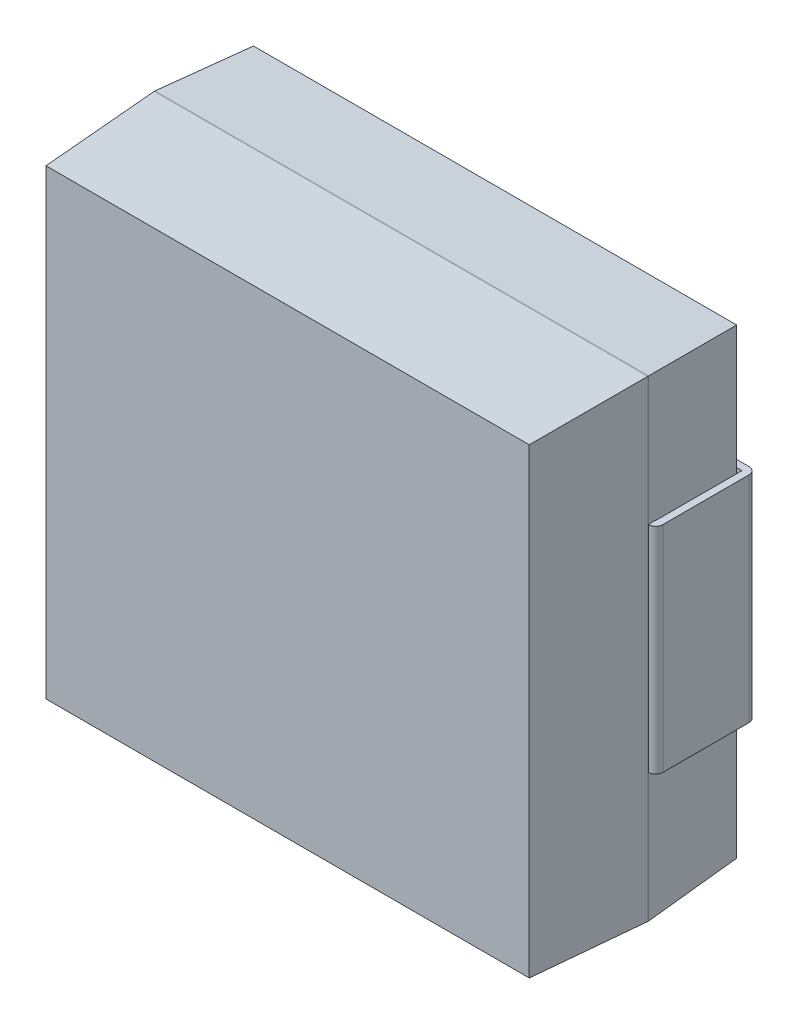
ISO-10303-21;
HEADER;
FILE_DESCRIPTION(('STEP AP214'),'2;1');
FILE_NAME('part.step','',(''),(''),'','','');
FILE_SCHEMA(('AUTOMOTIVE_DESIGN { 1 0 10303 214 1 1 1 1 }'));
ENDSEC;
DATA;
#1=APPLICATION_CONTEXT('core data for automotive mechanical design processes');
#2=APPLICATION_PROTOCOL_DEFINITION('international standard','automotive_design',2000,#1);
#3=PRODUCT_CONTEXT('',#1,'mechanical');
#4=PRODUCT('Part','Part','',(#3));
#5=PRODUCT_RELATED_PRODUCT_CATEGORY('part','',(#4));
#6=PRODUCT_DEFINITION_FORMATION('','',#4);
#7=PRODUCT_DEFINITION_CONTEXT('part definition',#1,'design');
#8=PRODUCT_DEFINITION('design','',#6,#7);
#9=PRODUCT_DEFINITION_SHAPE('','',#8);
#10=(LENGTH_UNIT() NAMED_UNIT(*) SI_UNIT(.MILLI.,.METRE.));
#11=(NAMED_UNIT(*) PLANE_ANGLE_UNIT() SI_UNIT($,.RADIAN.));
#12=(NAMED_UNIT(*) SI_UNIT($,.STERADIAN.) SOLID_ANGLE_UNIT());
#13=UNCERTAINTY_MEASURE_WITH_UNIT(LENGTH_MEASURE(1.E-05),#10,'distance_accuracy_value','');
#14=(GEOMETRIC_REPRESENTATION_CONTEXT(3) GLOBAL_UNCERTAINTY_ASSIGNED_CONTEXT((#13)) GLOBAL_UNIT_ASSIGNED_CONTEXT((#10,
#11,#12)) REPRESENTATION_CONTEXT('',''));
#15=CARTESIAN_POINT('',(0.,0.,0.));
#16=DIRECTION('',(0.,0.,1.));
#17=DIRECTION('',(1.,0.,0.));
#18=AXIS2_PLACEMENT_3D('',#15,#16,#17);
#19=CARTESIAN_POINT('',(-3.45,-3.3,0.1));
#20=DIRECTION('',(1.,0.,0.));
#21=DIRECTION('',(0.,0.,1.));
#22=AXIS2_PLACEMENT_3D('',#19,#20,#21);
#23=PLANE('',#22);
#24=DIRECTION('',(0.,1.,0.));
#25=VECTOR('',#24,1.);
#26=CARTESIAN_POINT('',(-3.45,-3.3,1.415));
#27=LINE('',#26,#25);
#28=CARTESIAN_POINT('',(-3.45,-3.3,1.415));
#29=VERTEX_POINT('',#28);
#30=CARTESIAN_POINT('',(-3.45,3.3,1.415));
#31=VERTEX_POINT('',#30);
#32=EDGE_CURVE('P0_E11',#29,#31,#27,.T.);
#33=ORIENTED_EDGE('',*,*,#32,.T.);
#34=DIRECTION('',(0.,0.,1.));
#35=VECTOR('',#34,1.);
#36=CARTESIAN_POINT('',(-3.45,3.3,0.1));
#37=LINE('',#36,#35);
#38=CARTESIAN_POINT('',(-3.45,3.3,1.405));
#39=VERTEX_POINT('',#38);
#40=EDGE_CURVE('P0_E24',#39,#31,#37,.T.);
#41=ORIENTED_EDGE('',*,*,#40,.F.);
#42=DIRECTION('',(0.,1.,0.));
#43=VECTOR('',#42,1.);
#44=CARTESIAN_POINT('',(-3.45,-3.3,1.405));
#45=LINE('',#44,#43);
#46=CARTESIAN_POINT('',(-3.45,-3.3,1.405));
#47=VERTEX_POINT('',#46);
#48=EDGE_CURVE('P0_E156',#47,#39,#45,.T.);
#49=ORIENTED_EDGE('',*,*,#48,.F.);
#50=DIRECTION('',(0.,0.,1.));
#51=VECTOR('',#50,1.);
#52=CARTESIAN_POINT('',(-3.45,-3.3,0.1));
#53=LINE('',#52,#51);
#54=EDGE_CURVE('P0_E36',#47,#29,#53,.T.);
#55=ORIENTED_EDGE('',*,*,#54,.T.);
#56=EDGE_LOOP('',(#33,#41,#49,#55));
#57=FACE_BOUND('',#56,.T.);
#58=ADVANCED_FACE('P0_F17',(#57),#23,.F.);
#59=CARTESIAN_POINT('',(-3.45,-3.3,0.1));
#60=DIRECTION('',(0.,1.,0.));
#61=DIRECTION('',(0.,0.,1.));
#62=AXIS2_PLACEMENT_3D('',#59,#60,#61);
#63=PLANE('',#62);
#64=DIRECTION('',(1.,0.,0.));
#65=VECTOR('',#64,1.);
#66=CARTESIAN_POINT('',(-3.45,-3.3,1.415));
#67=LINE('',#66,#65);
#68=CARTESIAN_POINT('',(3.45,-3.3,1.415));
#69=VERTEX_POINT('',#68);
#70=EDGE_CURVE('P0_E152',#29,#69,#67,.T.);
#71=ORIENTED_EDGE('',*,*,#70,.F.);
#72=ORIENTED_EDGE('',*,*,#54,.F.);
#73=DIRECTION('',(1.,0.,0.));
#74=VECTOR('',#73,1.);
#75=CARTESIAN_POINT('',(-3.45,-3.3,1.405));
#76=LINE('',#75,#74);
#77=CARTESIAN_POINT('',(3.45,-3.3,1.405));
#78=VERTEX_POINT('',#77);
#79=EDGE_CURVE('P0_E149',#47,#78,#76,.T.);
#80=ORIENTED_EDGE('',*,*,#79,.T.);
#81=DIRECTION('',(0.,0.,1.));
#82=VECTOR('',#81,1.);
#83=CARTESIAN_POINT('',(3.45,-3.3,0.1));
#84=LINE('',#83,#82);
#85=EDGE_CURVE('P0_E147',#78,#69,#84,.T.);
#86=ORIENTED_EDGE('',*,*,#85,.T.);
#87=EDGE_LOOP('',(#71,#72,#80,#86));
#88=FACE_BOUND('',#87,.T.);
#89=ADVANCED_FACE('P0_F182',(#88),#63,.F.);
#90=CARTESIAN_POINT('',(-3.41375,-3.3,0.7525));
#91=DIRECTION('',(-0.998460353205411,0.,-0.055470019622543));
#92=DIRECTION('',(0.,1.,0.));
#93=AXIS2_PLACEMENT_3D('',#90,#91,#92);
#94=PLANE('',#93);
#95=DIRECTION('',(0.055384877562174,0.055384877562174,-0.99692779611908));
#96=VECTOR('',#95,1.);
#97=CARTESIAN_POINT('',(-3.413861196319,-3.263861196319,0.754501533742));
#98=LINE('',#97,#96);
#99=CARTESIAN_POINT('',(-3.3775,-3.2275,0.1));
#100=VERTEX_POINT('',#99);
#101=EDGE_CURVE('P0_E145',#47,#100,#98,.T.);
#102=ORIENTED_EDGE('',*,*,#101,.F.);
#103=ORIENTED_EDGE('',*,*,#48,.T.);
#104=DIRECTION('',(0.055384877562174,-0.055384877562174,-0.99692779611908));
#105=VECTOR('',#104,1.);
#106=CARTESIAN_POINT('',(-3.403738496933,3.253738496933,0.572292944785));
#107=LINE('',#106,#105);
#108=CARTESIAN_POINT('',(-3.3775,3.2275,0.1));
#109=VERTEX_POINT('',#108);
#110=EDGE_CURVE('P0_E143',#39,#109,#107,.T.);
#111=ORIENTED_EDGE('',*,*,#110,.T.);
#112=DIRECTION('',(0.,1.,0.));
#113=VECTOR('',#112,1.);
#114=CARTESIAN_POINT('',(-3.3775,-3.3,0.1));
#115=LINE('',#114,#113);
#116=EDGE_CURVE('P0_E140',#100,#109,#115,.T.);
#117=ORIENTED_EDGE('',*,*,#116,.F.);
#118=EDGE_LOOP('',(#102,#103,#111,#117));
#119=FACE_BOUND('',#118,.T.);
#120=ADVANCED_FACE('P0_F159',(#119),#94,.T.);
#121=CARTESIAN_POINT('',(-3.41375,-3.3,2.2075));
#122=DIRECTION('',(0.998955504336026,0.,-0.045693548305591));
#123=DIRECTION('',(0.,1.,0.));
#124=AXIS2_PLACEMENT_3D('',#121,#122,#123);
#125=PLANE('',#124);
#126=DIRECTION('',(0.,1.,0.));
#127=VECTOR('',#126,1.);
#128=CARTESIAN_POINT('',(-3.3775,-3.3,3.));
#129=LINE('',#128,#127);
#130=CARTESIAN_POINT('',(-3.3775,-3.2275,3.));
#131=VERTEX_POINT('',#130);
#132=CARTESIAN_POINT('',(-3.3775,3.2275,3.));
#133=VERTEX_POINT('',#132);
#134=EDGE_CURVE('P0_E138',#131,#133,#129,.T.);
#135=ORIENTED_EDGE('',*,*,#134,.T.);
#136=DIRECTION('',(0.045645921085408,-0.045645921085408,0.997914274763384));
#137=VECTOR('',#136,1.);
#138=CARTESIAN_POINT('',(-3.406949813323,3.256949813323,2.356166150115));
#139=LINE('',#138,#137);
#140=EDGE_CURVE('P0_E100',#31,#133,#139,.T.);
#141=ORIENTED_EDGE('',*,*,#140,.F.);
#142=ORIENTED_EDGE('',*,*,#32,.F.);
#143=DIRECTION('',(0.045645921085408,0.045645921085408,0.997914274763384));
#144=VECTOR('',#143,1.);
#145=CARTESIAN_POINT('',(-3.413825528692,-3.263825528692,2.205848786536));
#146=LINE('',#145,#144);
#147=EDGE_CURVE('P0_E135',#29,#131,#146,.T.);
#148=ORIENTED_EDGE('',*,*,#147,.T.);
#149=EDGE_LOOP('',(#135,#141,#142,#148));
#150=FACE_BOUND('',#149,.T.);
#151=ADVANCED_FACE('P0_F187',(#150),#125,.F.);
#152=CARTESIAN_POINT('',(-3.45,3.3,0.1));
#153=DIRECTION('',(0.,1.,0.));
#154=DIRECTION('',(0.,0.,1.));
#155=AXIS2_PLACEMENT_3D('',#152,#153,#154);
#156=PLANE('',#155);
#157=DIRECTION('',(0.,0.,1.));
#158=VECTOR('',#157,1.);
#159=CARTESIAN_POINT('',(3.45,3.3,0.1));
#160=LINE('',#159,#158);
#161=CARTESIAN_POINT('',(3.45,3.3,1.405));
#162=VERTEX_POINT('',#161);
#163=CARTESIAN_POINT('',(3.45,3.3,1.415));
#164=VERTEX_POINT('',#163);
#165=EDGE_CURVE('P0_E133',#162,#164,#160,.T.);
#166=ORIENTED_EDGE('',*,*,#165,.F.);
#167=DIRECTION('',(1.,0.,0.));
#168=VECTOR('',#167,1.);
#169=CARTESIAN_POINT('',(-3.45,3.3,1.405));
#170=LINE('',#169,#168);
#171=EDGE_CURVE('P0_E130',#39,#162,#170,.T.);
#172=ORIENTED_EDGE('',*,*,#171,.F.);
#173=ORIENTED_EDGE('',*,*,#40,.T.);
#174=DIRECTION('',(1.,0.,0.));
#175=VECTOR('',#174,1.);
#176=CARTESIAN_POINT('',(-3.45,3.3,1.415));
#177=LINE('',#176,#175);
#178=EDGE_CURVE('P0_E128',#31,#164,#177,.T.);
#179=ORIENTED_EDGE('',*,*,#178,.T.);
#180=EDGE_LOOP('',(#166,#172,#173,#179));
#181=FACE_BOUND('',#180,.T.);
#182=ADVANCED_FACE('P0_F166',(#181),#156,.T.);
#183=CARTESIAN_POINT('',(3.45,-3.3,0.1));
#184=DIRECTION('',(1.,0.,0.));
#185=DIRECTION('',(0.,0.,1.));
#186=AXIS2_PLACEMENT_3D('',#183,#184,#185);
#187=PLANE('',#186);
#188=ORIENTED_EDGE('',*,*,#85,.F.);
#189=DIRECTION('',(0.,1.,0.));
#190=VECTOR('',#189,1.);
#191=CARTESIAN_POINT('',(3.45,-3.3,1.405));
#192=LINE('',#191,#190);
#193=EDGE_CURVE('P0_E125',#78,#162,#192,.T.);
#194=ORIENTED_EDGE('',*,*,#193,.T.);
#195=ORIENTED_EDGE('',*,*,#165,.T.);
#196=DIRECTION('',(0.,1.,0.));
#197=VECTOR('',#196,1.);
#198=CARTESIAN_POINT('',(3.45,-3.3,1.415));
#199=LINE('',#198,#197);
#200=EDGE_CURVE('P0_E106',#69,#164,#199,.T.);
#201=ORIENTED_EDGE('',*,*,#200,.F.);
#202=EDGE_LOOP('',(#188,#194,#195,#201));
#203=FACE_BOUND('',#202,.T.);
#204=ADVANCED_FACE('P0_F168',(#203),#187,.T.);
#205=CARTESIAN_POINT('',(-3.45,-3.26375,0.7525));
#206=DIRECTION('',(0.,-0.998460353205411,-0.055470019622543));
#207=DIRECTION('',(-1.,0.,0.));
#208=AXIS2_PLACEMENT_3D('',#205,#206,#207);
#209=PLANE('',#208);
#210=DIRECTION('',(1.,0.,0.));
#211=VECTOR('',#210,1.);
#212=CARTESIAN_POINT('',(-3.45,-3.2275,0.1));
#213=LINE('',#212,#211);
#214=CARTESIAN_POINT('',(3.3775,-3.2275,0.1));
#215=VERTEX_POINT('',#214);
#216=EDGE_CURVE('P0_E121',#100,#215,#213,.T.);
#217=ORIENTED_EDGE('',*,*,#216,.T.);
#218=DIRECTION('',(-0.055384877562174,0.055384877562174,-0.99692779611908));
#219=VECTOR('',#218,1.);
#220=CARTESIAN_POINT('',(3.403278374233,-3.253278374233,0.564010736196));
#221=LINE('',#220,#219);
#222=EDGE_CURVE('P0_E119',#78,#215,#221,.T.);
#223=ORIENTED_EDGE('',*,*,#222,.F.);
#224=ORIENTED_EDGE('',*,*,#79,.F.);
#225=ORIENTED_EDGE('',*,*,#101,.T.);
#226=EDGE_LOOP('',(#217,#223,#224,#225));
#227=FACE_BOUND('',#226,.T.);
#228=ADVANCED_FACE('P0_F179',(#227),#209,.T.);
#229=CARTESIAN_POINT('',(-3.45,-3.26375,2.2075));
#230=DIRECTION('',(0.,0.998955504336026,-0.045693548305591));
#231=DIRECTION('',(-1.,0.,0.));
#232=AXIS2_PLACEMENT_3D('',#229,#230,#231);
#233=PLANE('',#232);
#234=ORIENTED_EDGE('',*,*,#147,.F.);
#235=ORIENTED_EDGE('',*,*,#70,.T.);
#236=DIRECTION('',(-0.045645921085408,0.045645921085408,0.997914274763384));
#237=VECTOR('',#236,1.);
#238=CARTESIAN_POINT('',(3.406637280806,-3.256637280806,2.36299875755));
#239=LINE('',#238,#237);
#240=CARTESIAN_POINT('',(3.3775,-3.2275,3.));
#241=VERTEX_POINT('',#240);
#242=EDGE_CURVE('P0_E117',#69,#241,#239,.T.);
#243=ORIENTED_EDGE('',*,*,#242,.T.);
#244=DIRECTION('',(1.,0.,0.));
#245=VECTOR('',#244,1.);
#246=CARTESIAN_POINT('',(-3.45,-3.2275,3.));
#247=LINE('',#246,#245);
#248=EDGE_CURVE('P0_E88',#131,#241,#247,.T.);
#249=ORIENTED_EDGE('',*,*,#248,.F.);
#250=EDGE_LOOP('',(#234,#235,#243,#249));
#251=FACE_BOUND('',#250,.T.);
#252=ADVANCED_FACE('P0_F185',(#251),#233,.F.);
#253=CARTESIAN_POINT('',(-3.45,-3.3,0.1));
#254=DIRECTION('',(0.,0.,1.));
#255=DIRECTION('',(1.,0.,0.));
#256=AXIS2_PLACEMENT_3D('',#253,#254,#255);
#257=PLANE('',#256);
#258=DIRECTION('',(1.,0.,0.));
#259=VECTOR('',#258,1.);
#260=CARTESIAN_POINT('',(-3.45,3.2275,0.1));
#261=LINE('',#260,#259);
#262=CARTESIAN_POINT('',(3.3775,3.2275,0.1));
#263=VERTEX_POINT('',#262);
#264=EDGE_CURVE('P0_E113',#109,#263,#261,.T.);
#265=ORIENTED_EDGE('',*,*,#264,.T.);
#266=DIRECTION('',(0.,1.,0.));
#267=VECTOR('',#266,1.);
#268=CARTESIAN_POINT('',(3.3775,-3.3,0.1));
#269=LINE('',#268,#267);
#270=EDGE_CURVE('P0_E111',#215,#263,#269,.T.);
#271=ORIENTED_EDGE('',*,*,#270,.F.);
#272=ORIENTED_EDGE('',*,*,#216,.F.);
#273=ORIENTED_EDGE('',*,*,#116,.T.);
#274=EDGE_LOOP('',(#265,#271,#272,#273));
#275=FACE_BOUND('',#274,.T.);
#276=ADVANCED_FACE('P0_F177',(#275),#257,.F.);
#277=CARTESIAN_POINT('',(-3.45,3.26375,0.7525));
#278=DIRECTION('',(0.,-0.998460353205411,0.055470019622543));
#279=DIRECTION('',(-1.,0.,0.));
#280=AXIS2_PLACEMENT_3D('',#277,#278,#279);
#281=PLANE('',#280);
#282=ORIENTED_EDGE('',*,*,#110,.F.);
#283=ORIENTED_EDGE('',*,*,#171,.T.);
#284=DIRECTION('',(-0.055384877562174,-0.055384877562174,-0.99692779611908));
#285=VECTOR('',#284,1.);
#286=CARTESIAN_POINT('',(3.393155674847,3.243155674847,0.381802147239));
#287=LINE('',#286,#285);
#288=EDGE_CURVE('P0_E92',#162,#263,#287,.T.);
#289=ORIENTED_EDGE('',*,*,#288,.T.);
#290=ORIENTED_EDGE('',*,*,#264,.F.);
#291=EDGE_LOOP('',(#282,#283,#289,#290));
#292=FACE_BOUND('',#291,.T.);
#293=ADVANCED_FACE('P0_F165',(#292),#281,.F.);
#294=CARTESIAN_POINT('',(-3.45,-3.3,3.));
#295=DIRECTION('',(0.,0.,1.));
#296=DIRECTION('',(1.,0.,0.));
#297=AXIS2_PLACEMENT_3D('',#294,#295,#296);
#298=PLANE('',#297);
#299=ORIENTED_EDGE('',*,*,#134,.F.);
#300=ORIENTED_EDGE('',*,*,#248,.T.);
#301=DIRECTION('',(0.,1.,0.));
#302=VECTOR('',#301,1.);
#303=CARTESIAN_POINT('',(3.3775,-3.3,3.));
#304=LINE('',#303,#302);
#305=CARTESIAN_POINT('',(3.3775,3.2275,3.));
#306=VERTEX_POINT('',#305);
#307=EDGE_CURVE('P0_E82',#241,#306,#304,.T.);
#308=ORIENTED_EDGE('',*,*,#307,.T.);
#309=DIRECTION('',(1.,0.,0.));
#310=VECTOR('',#309,1.);
#311=CARTESIAN_POINT('',(-3.45,3.2275,3.));
#312=LINE('',#311,#310);
#313=EDGE_CURVE('P0_E86',#133,#306,#312,.T.);
#314=ORIENTED_EDGE('',*,*,#313,.F.);
#315=EDGE_LOOP('',(#299,#300,#308,#314));
#316=FACE_BOUND('',#315,.T.);
#317=ADVANCED_FACE('P0_F85',(#316),#298,.T.);
#318=CARTESIAN_POINT('',(-3.45,3.26375,2.2075));
#319=DIRECTION('',(0.,0.998955504336026,0.045693548305591));
#320=DIRECTION('',(-1.,0.,0.));
#321=AXIS2_PLACEMENT_3D('',#318,#319,#320);
#322=PLANE('',#321);
#323=ORIENTED_EDGE('',*,*,#313,.T.);
#324=DIRECTION('',(-0.045645921085408,-0.045645921085408,0.997914274763384));
#325=VECTOR('',#324,1.);
#326=CARTESIAN_POINT('',(3.399761565437,3.249761565437,2.513316121128));
#327=LINE('',#326,#325);
#328=EDGE_CURVE('P0_E98',#164,#306,#327,.T.);
#329=ORIENTED_EDGE('',*,*,#328,.F.);
#330=ORIENTED_EDGE('',*,*,#178,.F.);
#331=ORIENTED_EDGE('',*,*,#140,.T.);
#332=EDGE_LOOP('',(#323,#329,#330,#331));
#333=FACE_BOUND('',#332,.T.);
#334=ADVANCED_FACE('P0_F96',(#333),#322,.T.);
#335=CARTESIAN_POINT('',(3.41375,-3.3,0.7525));
#336=DIRECTION('',(-0.998460353205411,0.,0.055470019622543));
#337=DIRECTION('',(0.,1.,0.));
#338=AXIS2_PLACEMENT_3D('',#335,#336,#337);
#339=PLANE('',#338);
#340=ORIENTED_EDGE('',*,*,#270,.T.);
#341=ORIENTED_EDGE('',*,*,#288,.F.);
#342=ORIENTED_EDGE('',*,*,#193,.F.);
#343=ORIENTED_EDGE('',*,*,#222,.T.);
#344=EDGE_LOOP('',(#340,#341,#342,#343));
#345=FACE_BOUND('',#344,.T.);
#346=ADVANCED_FACE('P0_F173',(#345),#339,.F.);
#347=CARTESIAN_POINT('',(3.41375,-3.3,2.2075));
#348=DIRECTION('',(0.998955504336026,0.,0.045693548305591));
#349=DIRECTION('',(0.,1.,0.));
#350=AXIS2_PLACEMENT_3D('',#347,#348,#349);
#351=PLANE('',#350);
#352=ORIENTED_EDGE('',*,*,#242,.F.);
#353=ORIENTED_EDGE('',*,*,#200,.T.);
#354=ORIENTED_EDGE('',*,*,#328,.T.);
#355=ORIENTED_EDGE('',*,*,#307,.F.);
#356=EDGE_LOOP('',(#352,#353,#354,#355));
#357=FACE_BOUND('',#356,.T.);
#358=ADVANCED_FACE('P0_F104',(#357),#351,.T.);
#359=CLOSED_SHELL('',(#58,#89,#120,#151,#182,#204,#228,#252,#276,#293,#317,#334,#346,#358));
#360=MANIFOLD_SOLID_BREP('P0_B1',#359);
#361=CARTESIAN_POINT('',(-2.956299659478,-1.5,0.687687287174));
#362=DIRECTION('',(0.,-1.,0.));
#363=DIRECTION('',(-1.,0.,0.));
#364=AXIS2_PLACEMENT_3D('',#361,#362,#363);
#365=PLANE('',#364);
#366=DIRECTION('',(1.,0.,0.));
#367=VECTOR('',#366,1.);
#368=CARTESIAN_POINT('',(-3.55,-1.5,1.405));
#369=LINE('',#368,#367);
#370=CARTESIAN_POINT('',(-3.45,-1.5,1.405));
#371=VERTEX_POINT('',#370);
#372=CARTESIAN_POINT('',(-2.05,-1.5,1.405));
#373=VERTEX_POINT('',#372);
#374=EDGE_CURVE('P1_E11',#371,#373,#369,.T.);
#375=ORIENTED_EDGE('',*,*,#374,.F.);
#376=CARTESIAN_POINT('',(-3.45,-1.5,1.305));
#377=DIRECTION('',(0.,-1.,0.));
#378=DIRECTION('',(0.,0.,1.));
#379=AXIS2_PLACEMENT_3D('',#376,#377,#378);
#380=CIRCLE('',#379,0.1);
#381=CARTESIAN_POINT('',(-3.55,-1.5,1.305));
#382=VERTEX_POINT('',#381);
#383=EDGE_CURVE('P1_E24',#371,#382,#380,.T.);
#384=ORIENTED_EDGE('',*,*,#383,.T.);
#385=DIRECTION('',(0.,0.,1.));
#386=VECTOR('',#385,1.);
#387=CARTESIAN_POINT('',(-3.55,-1.5,0.));
#388=LINE('',#387,#386);
#389=CARTESIAN_POINT('',(-3.55,-1.5,0.1));
#390=VERTEX_POINT('',#389);
#391=EDGE_CURVE('P1_E168',#390,#382,#388,.T.);
#392=ORIENTED_EDGE('',*,*,#391,.F.);
#393=CARTESIAN_POINT('',(-3.45,-1.5,0.1));
#394=DIRECTION('',(0.,-1.,0.));
#395=DIRECTION('',(0.,0.,1.));
#396=AXIS2_PLACEMENT_3D('',#393,#394,#395);
#397=CIRCLE('',#396,0.1);
#398=CARTESIAN_POINT('',(-3.45,-1.5,0.));
#399=VERTEX_POINT('',#398);
#400=EDGE_CURVE('P1_E166',#390,#399,#397,.T.);
#401=ORIENTED_EDGE('',*,*,#400,.T.);
#402=DIRECTION('',(1.,0.,0.));
#403=VECTOR('',#402,1.);
#404=CARTESIAN_POINT('',(-3.55,-1.5,0.));
#405=LINE('',#404,#403);
#406=CARTESIAN_POINT('',(-1.95,-1.5,0.));
#407=VERTEX_POINT('',#406);
#408=EDGE_CURVE('P1_E164',#399,#407,#405,.T.);
#409=ORIENTED_EDGE('',*,*,#408,.T.);
#410=DIRECTION('',(0.,0.,1.));
#411=VECTOR('',#410,1.);
#412=CARTESIAN_POINT('',(-1.95,-1.5,0.));
#413=LINE('',#412,#411);
#414=CARTESIAN_POINT('',(-1.95,-1.5,0.1));
#415=VERTEX_POINT('',#414);
#416=EDGE_CURVE('P1_E162',#407,#415,#413,.T.);
#417=ORIENTED_EDGE('',*,*,#416,.T.);
#418=DIRECTION('',(1.,0.,0.));
#419=VECTOR('',#418,1.);
#420=CARTESIAN_POINT('',(-3.55,-1.5,0.1));
#421=LINE('',#420,#419);
#422=CARTESIAN_POINT('',(-3.45,-1.5,0.1));
#423=VERTEX_POINT('',#422);
#424=EDGE_CURVE('P1_E107',#423,#415,#421,.T.);
#425=ORIENTED_EDGE('',*,*,#424,.F.);
#426=DIRECTION('',(0.,0.,1.));
#427=VECTOR('',#426,1.);
#428=CARTESIAN_POINT('',(-3.45,-1.5,0.));
#429=LINE('',#428,#427);
#430=CARTESIAN_POINT('',(-3.45,-1.5,1.305));
#431=VERTEX_POINT('',#430);
#432=EDGE_CURVE('P1_E159',#423,#431,#429,.T.);
#433=ORIENTED_EDGE('',*,*,#432,.T.);
#434=DIRECTION('',(1.,0.,0.));
#435=VECTOR('',#434,1.);
#436=CARTESIAN_POINT('',(-3.55,-1.5,1.305));
#437=LINE('',#436,#435);
#438=CARTESIAN_POINT('',(-2.05,-1.5,1.305));
#439=VERTEX_POINT('',#438);
#440=EDGE_CURVE('P1_E157',#431,#439,#437,.T.);
#441=ORIENTED_EDGE('',*,*,#440,.T.);
#442=DIRECTION('',(0.,0.,1.));
#443=VECTOR('',#442,1.);
#444=CARTESIAN_POINT('',(-2.05,-1.5,1.305));
#445=LINE('',#444,#443);
#446=EDGE_CURVE('P1_E155',#439,#373,#445,.T.);
#447=ORIENTED_EDGE('',*,*,#446,.T.);
#448=EDGE_LOOP('',(#375,#384,#392,#401,#409,#417,#425,#433,#441,#447));
#449=FACE_BOUND('',#448,.T.);
#450=ADVANCED_FACE('P1_F17',(#449),#365,.T.);
#451=CARTESIAN_POINT('',(-3.55,-1.5,1.405));
#452=DIRECTION('',(0.,0.,1.));
#453=DIRECTION('',(1.,0.,0.));
#454=AXIS2_PLACEMENT_3D('',#451,#452,#453);
#455=PLANE('',#454);
#456=DIRECTION('',(1.,0.,0.));
#457=VECTOR('',#456,1.);
#458=CARTESIAN_POINT('',(-3.55,1.5,1.405));
#459=LINE('',#458,#457);
#460=CARTESIAN_POINT('',(-3.45,1.5,1.405));
#461=VERTEX_POINT('',#460);
#462=CARTESIAN_POINT('',(-2.05,1.5,1.405));
#463=VERTEX_POINT('',#462);
#464=EDGE_CURVE('P1_E153',#461,#463,#459,.T.);
#465=ORIENTED_EDGE('',*,*,#464,.F.);
#466=DIRECTION('',(0.,1.,0.));
#467=VECTOR('',#466,1.);
#468=CARTESIAN_POINT('',(-3.45,-1.5,1.405));
#469=LINE('',#468,#467);
#470=EDGE_CURVE('P1_E150',#371,#461,#469,.T.);
#471=ORIENTED_EDGE('',*,*,#470,.F.);
#472=ORIENTED_EDGE('',*,*,#374,.T.);
#473=DIRECTION('',(0.,1.,0.));
#474=VECTOR('',#473,1.);
#475=CARTESIAN_POINT('',(-2.05,-1.5,1.405));
#476=LINE('',#475,#474);
#477=EDGE_CURVE('P1_E148',#373,#463,#476,.T.);
#478=ORIENTED_EDGE('',*,*,#477,.T.);
#479=EDGE_LOOP('',(#465,#471,#472,#478));
#480=FACE_BOUND('',#479,.T.);
#481=ADVANCED_FACE('P1_F199',(#480),#455,.T.);
#482=CARTESIAN_POINT('',(-3.45,-1.5,1.305));
#483=DIRECTION('',(0.,1.,0.));
#484=DIRECTION('',(0.,0.,1.));
#485=AXIS2_PLACEMENT_3D('',#482,#483,#484);
#486=CYLINDRICAL_SURFACE('',#485,0.1);
#487=ORIENTED_EDGE('',*,*,#470,.T.);
#488=CARTESIAN_POINT('',(-3.45,1.5,1.305));
#489=DIRECTION('',(0.,-1.,0.));
#490=DIRECTION('',(0.,0.,1.));
#491=AXIS2_PLACEMENT_3D('',#488,#489,#490);
#492=CIRCLE('',#491,0.1);
#493=CARTESIAN_POINT('',(-3.55,1.5,1.305));
#494=VERTEX_POINT('',#493);
#495=EDGE_CURVE('P1_E146',#461,#494,#492,.T.);
#496=ORIENTED_EDGE('',*,*,#495,.T.);
#497=DIRECTION('',(0.,1.,0.));
#498=VECTOR('',#497,1.);
#499=CARTESIAN_POINT('',(-3.55,-1.5,1.305));
#500=LINE('',#499,#498);
#501=EDGE_CURVE('P1_E143',#382,#494,#500,.T.);
#502=ORIENTED_EDGE('',*,*,#501,.F.);
#503=ORIENTED_EDGE('',*,*,#383,.F.);
#504=EDGE_LOOP('',(#487,#496,#502,#503));
#505=FACE_BOUND('',#504,.T.);
#506=ADVANCED_FACE('P1_F177',(#505),#486,.T.);
#507=CARTESIAN_POINT('',(-2.05,-1.5,1.305));
#508=DIRECTION('',(1.,0.,0.));
#509=DIRECTION('',(0.,0.,1.));
#510=AXIS2_PLACEMENT_3D('',#507,#508,#509);
#511=PLANE('',#510);
#512=ORIENTED_EDGE('',*,*,#446,.F.);
#513=DIRECTION('',(0.,1.,0.));
#514=VECTOR('',#513,1.);
#515=CARTESIAN_POINT('',(-2.05,-1.5,1.305));
#516=LINE('',#515,#514);
#517=CARTESIAN_POINT('',(-2.05,1.5,1.305));
#518=VERTEX_POINT('',#517);
#519=EDGE_CURVE('P1_E141',#439,#518,#516,.T.);
#520=ORIENTED_EDGE('',*,*,#519,.T.);
#521=DIRECTION('',(0.,0.,1.));
#522=VECTOR('',#521,1.);
#523=CARTESIAN_POINT('',(-2.05,1.5,1.305));
#524=LINE('',#523,#522);
#525=EDGE_CURVE('P1_E138',#518,#463,#524,.T.);
#526=ORIENTED_EDGE('',*,*,#525,.T.);
#527=ORIENTED_EDGE('',*,*,#477,.F.);
#528=EDGE_LOOP('',(#512,#520,#526,#527));
#529=FACE_BOUND('',#528,.T.);
#530=ADVANCED_FACE('P1_F198',(#529),#511,.T.);
#531=CARTESIAN_POINT('',(-3.55,-1.5,0.));
#532=DIRECTION('',(1.,0.,0.));
#533=DIRECTION('',(0.,0.,1.));
#534=AXIS2_PLACEMENT_3D('',#531,#532,#533);
#535=PLANE('',#534);
#536=ORIENTED_EDGE('',*,*,#501,.T.);
#537=DIRECTION('',(0.,0.,1.));
#538=VECTOR('',#537,1.);
#539=CARTESIAN_POINT('',(-3.55,1.5,0.));
#540=LINE('',#539,#538);
#541=CARTESIAN_POINT('',(-3.55,1.5,0.1));
#542=VERTEX_POINT('',#541);
#543=EDGE_CURVE('P1_E135',#542,#494,#540,.T.);
#544=ORIENTED_EDGE('',*,*,#543,.F.);
#545=DIRECTION('',(0.,1.,0.));
#546=VECTOR('',#545,1.);
#547=CARTESIAN_POINT('',(-3.55,-1.5,0.1));
#548=LINE('',#547,#546);
#549=EDGE_CURVE('P1_E133',#390,#542,#548,.T.);
#550=ORIENTED_EDGE('',*,*,#549,.F.);
#551=ORIENTED_EDGE('',*,*,#391,.T.);
#552=EDGE_LOOP('',(#536,#544,#550,#551));
#553=FACE_BOUND('',#552,.T.);
#554=ADVANCED_FACE('P1_F175',(#553),#535,.F.);
#555=CARTESIAN_POINT('',(-3.55,-1.5,1.305));
#556=DIRECTION('',(0.,0.,1.));
#557=DIRECTION('',(1.,0.,0.));
#558=AXIS2_PLACEMENT_3D('',#555,#556,#557);
#559=PLANE('',#558);
#560=ORIENTED_EDGE('',*,*,#519,.F.);
#561=ORIENTED_EDGE('',*,*,#440,.F.);
#562=DIRECTION('',(0.,1.,0.));
#563=VECTOR('',#562,1.);
#564=CARTESIAN_POINT('',(-3.45,-1.5,1.305));
#565=LINE('',#564,#563);
#566=CARTESIAN_POINT('',(-3.45,1.5,1.305));
#567=VERTEX_POINT('',#566);
#568=EDGE_CURVE('P1_E130',#431,#567,#565,.T.);
#569=ORIENTED_EDGE('',*,*,#568,.T.);
#570=DIRECTION('',(1.,0.,0.));
#571=VECTOR('',#570,1.);
#572=CARTESIAN_POINT('',(-3.55,1.5,1.305));
#573=LINE('',#572,#571);
#574=EDGE_CURVE('P1_E127',#567,#518,#573,.T.);
#575=ORIENTED_EDGE('',*,*,#574,.T.);
#576=EDGE_LOOP('',(#560,#561,#569,#575));
#577=FACE_BOUND('',#576,.T.);
#578=ADVANCED_FACE('P1_F194',(#577),#559,.F.);
#579=CARTESIAN_POINT('',(-3.45,-1.5,0.1));
#580=DIRECTION('',(0.,1.,0.));
#581=DIRECTION('',(-1.,0.,0.));
#582=AXIS2_PLACEMENT_3D('',#579,#580,#581);
#583=CYLINDRICAL_SURFACE('',#582,0.1);
#584=ORIENTED_EDGE('',*,*,#549,.T.);
#585=CARTESIAN_POINT('',(-3.45,1.5,0.1));
#586=DIRECTION('',(0.,-1.,0.));
#587=DIRECTION('',(0.,0.,1.));
#588=AXIS2_PLACEMENT_3D('',#585,#586,#587);
#589=CIRCLE('',#588,0.1);
#590=CARTESIAN_POINT('',(-3.45,1.5,0.));
#591=VERTEX_POINT('',#590);
#592=EDGE_CURVE('P1_E125',#542,#591,#589,.T.);
#593=ORIENTED_EDGE('',*,*,#592,.T.);
#594=DIRECTION('',(0.,1.,0.));
#595=VECTOR('',#594,1.);
#596=CARTESIAN_POINT('',(-3.45,-1.5,0.));
#597=LINE('',#596,#595);
#598=EDGE_CURVE('P1_E122',#399,#591,#597,.T.);
#599=ORIENTED_EDGE('',*,*,#598,.F.);
#600=ORIENTED_EDGE('',*,*,#400,.F.);
#601=EDGE_LOOP('',(#584,#593,#599,#600));
#602=FACE_BOUND('',#601,.T.);
#603=ADVANCED_FACE('P1_F183',(#602),#583,.T.);
#604=CARTESIAN_POINT('',(-3.45,-1.5,0.));
#605=DIRECTION('',(1.,0.,0.));
#606=DIRECTION('',(0.,0.,1.));
#607=AXIS2_PLACEMENT_3D('',#604,#605,#606);
#608=PLANE('',#607);
#609=ORIENTED_EDGE('',*,*,#432,.F.);
#610=DIRECTION('',(0.,-1.,0.));
#611=VECTOR('',#610,1.);
#612=CARTESIAN_POINT('',(-3.45,-1.5,0.1));
#613=LINE('',#612,#611);
#614=CARTESIAN_POINT('',(-3.45,1.5,0.1));
#615=VERTEX_POINT('',#614);
#616=EDGE_CURVE('P1_E120',#615,#423,#613,.T.);
#617=ORIENTED_EDGE('',*,*,#616,.F.);
#618=DIRECTION('',(0.,0.,1.));
#619=VECTOR('',#618,1.);
#620=CARTESIAN_POINT('',(-3.45,1.5,0.));
#621=LINE('',#620,#619);
#622=EDGE_CURVE('P1_E98',#615,#567,#621,.T.);
#623=ORIENTED_EDGE('',*,*,#622,.T.);
#624=ORIENTED_EDGE('',*,*,#568,.F.);
#625=EDGE_LOOP('',(#609,#617,#623,#624));
#626=FACE_BOUND('',#625,.T.);
#627=ADVANCED_FACE('P1_F191',(#626),#608,.T.);
#628=CARTESIAN_POINT('',(-3.55,-1.5,0.));
#629=DIRECTION('',(0.,0.,1.));
#630=DIRECTION('',(1.,0.,0.));
#631=AXIS2_PLACEMENT_3D('',#628,#629,#630);
#632=PLANE('',#631);
#633=DIRECTION('',(0.,1.,0.));
#634=VECTOR('',#633,1.);
#635=CARTESIAN_POINT('',(-1.95,-1.5,0.));
#636=LINE('',#635,#634);
#637=CARTESIAN_POINT('',(-1.95,1.5,0.));
#638=VERTEX_POINT('',#637);
#639=EDGE_CURVE('P1_E114',#407,#638,#636,.T.);
#640=ORIENTED_EDGE('',*,*,#639,.F.);
#641=ORIENTED_EDGE('',*,*,#408,.F.);
#642=ORIENTED_EDGE('',*,*,#598,.T.);
#643=DIRECTION('',(1.,0.,0.));
#644=VECTOR('',#643,1.);
#645=CARTESIAN_POINT('',(-3.55,1.5,0.));
#646=LINE('',#645,#644);
#647=EDGE_CURVE('P1_E101',#591,#638,#646,.T.);
#648=ORIENTED_EDGE('',*,*,#647,.T.);
#649=EDGE_LOOP('',(#640,#641,#642,#648));
#650=FACE_BOUND('',#649,.T.);
#651=ADVANCED_FACE('P1_F186',(#650),#632,.F.);
#652=CARTESIAN_POINT('',(-3.55,-1.5,0.1));
#653=DIRECTION('',(0.,0.,1.));
#654=DIRECTION('',(1.,0.,0.));
#655=AXIS2_PLACEMENT_3D('',#652,#653,#654);
#656=PLANE('',#655);
#657=DIRECTION('',(1.,0.,0.));
#658=VECTOR('',#657,1.);
#659=CARTESIAN_POINT('',(-3.55,1.5,0.1));
#660=LINE('',#659,#658);
#661=CARTESIAN_POINT('',(-1.95,1.5,0.1));
#662=VERTEX_POINT('',#661);
#663=EDGE_CURVE('P1_E91',#615,#662,#660,.T.);
#664=ORIENTED_EDGE('',*,*,#663,.F.);
#665=ORIENTED_EDGE('',*,*,#616,.T.);
#666=ORIENTED_EDGE('',*,*,#424,.T.);
#667=DIRECTION('',(0.,1.,0.));
#668=VECTOR('',#667,1.);
#669=CARTESIAN_POINT('',(-1.95,-1.5,0.1));
#670=LINE('',#669,#668);
#671=EDGE_CURVE('P1_E102',#415,#662,#670,.T.);
#672=ORIENTED_EDGE('',*,*,#671,.T.);
#673=EDGE_LOOP('',(#664,#665,#666,#672));
#674=FACE_BOUND('',#673,.T.);
#675=ADVANCED_FACE('P1_F106',(#674),#656,.T.);
#676=CARTESIAN_POINT('',(-1.95,-1.5,0.));
#677=DIRECTION('',(1.,0.,0.));
#678=DIRECTION('',(0.,0.,1.));
#679=AXIS2_PLACEMENT_3D('',#676,#677,#678);
#680=PLANE('',#679);
#681=ORIENTED_EDGE('',*,*,#416,.F.);
#682=ORIENTED_EDGE('',*,*,#639,.T.);
#683=DIRECTION('',(0.,0.,1.));
#684=VECTOR('',#683,1.);
#685=CARTESIAN_POINT('',(-1.95,1.5,0.));
#686=LINE('',#685,#684);
#687=EDGE_CURVE('P1_E96',#638,#662,#686,.T.);
#688=ORIENTED_EDGE('',*,*,#687,.T.);
#689=ORIENTED_EDGE('',*,*,#671,.F.);
#690=EDGE_LOOP('',(#681,#682,#688,#689));
#691=FACE_BOUND('',#690,.T.);
#692=ADVANCED_FACE('P1_F112',(#691),#680,.T.);
#693=CARTESIAN_POINT('',(-2.956299659478,1.5,0.687687287174));
#694=DIRECTION('',(0.,1.,0.));
#695=DIRECTION('',(1.,0.,0.));
#696=AXIS2_PLACEMENT_3D('',#693,#694,#695);
#697=PLANE('',#696);
#698=ORIENTED_EDGE('',*,*,#647,.F.);
#699=ORIENTED_EDGE('',*,*,#592,.F.);
#700=ORIENTED_EDGE('',*,*,#543,.T.);
#701=ORIENTED_EDGE('',*,*,#495,.F.);
#702=ORIENTED_EDGE('',*,*,#464,.T.);
#703=ORIENTED_EDGE('',*,*,#525,.F.);
#704=ORIENTED_EDGE('',*,*,#574,.F.);
#705=ORIENTED_EDGE('',*,*,#622,.F.);
#706=ORIENTED_EDGE('',*,*,#663,.T.);
#707=ORIENTED_EDGE('',*,*,#687,.F.);
#708=EDGE_LOOP('',(#698,#699,#700,#701,#702,#703,#704,#705,#706,#707));
#709=FACE_BOUND('',#708,.T.);
#710=ADVANCED_FACE('P1_F94',(#709),#697,.T.);
#711=CLOSED_SHELL('',(#450,#481,#506,#530,#554,#578,#603,#627,#651,#675,#692,#710));
#712=MANIFOLD_SOLID_BREP('P1_B1',#711);
#713=CARTESIAN_POINT('',(2.910423452769,-1.5,0.688330618893));
#714=DIRECTION('',(0.,-1.,0.));
#715=DIRECTION('',(0.,0.,-1.));
#716=AXIS2_PLACEMENT_3D('',#713,#714,#715);
#717=PLANE('',#716);
#718=DIRECTION('',(1.,0.,0.));
#719=VECTOR('',#718,1.);
#720=CARTESIAN_POINT('',(1.85,-1.5,0.));
#721=LINE('',#720,#719);
#722=CARTESIAN_POINT('',(1.85,-1.5,0.));
#723=VERTEX_POINT('',#722);
#724=CARTESIAN_POINT('',(3.45,-1.5,0.));
#725=VERTEX_POINT('',#724);
#726=EDGE_CURVE('P2_E10',#723,#725,#721,.T.);
#727=ORIENTED_EDGE('',*,*,#726,.T.);
#728=CARTESIAN_POINT('',(3.45,-1.5,0.1));
#729=DIRECTION('',(0.,1.,0.));
#730=DIRECTION('',(0.,0.,1.));
#731=AXIS2_PLACEMENT_3D('',#728,#729,#730);
#732=CIRCLE('',#731,0.1);
#733=CARTESIAN_POINT('',(3.55,-1.5,0.1));
#734=VERTEX_POINT('',#733);
#735=EDGE_CURVE('P2_E23',#734,#725,#732,.T.);
#736=ORIENTED_EDGE('',*,*,#735,.F.);
#737=DIRECTION('',(0.,0.,1.));
#738=VECTOR('',#737,1.);
#739=CARTESIAN_POINT('',(3.55,-1.5,0.));
#740=LINE('',#739,#738);
#741=CARTESIAN_POINT('',(3.55,-1.5,1.305));
#742=VERTEX_POINT('',#741);
#743=EDGE_CURVE('P2_E171',#734,#742,#740,.T.);
#744=ORIENTED_EDGE('',*,*,#743,.T.);
#745=CARTESIAN_POINT('',(3.45,-1.5,1.305));
#746=DIRECTION('',(0.,-1.,0.));
#747=DIRECTION('',(0.,0.,1.));
#748=AXIS2_PLACEMENT_3D('',#745,#746,#747);
#749=CIRCLE('',#748,0.1);
#750=CARTESIAN_POINT('',(3.45,-1.5,1.405));
#751=VERTEX_POINT('',#750);
#752=EDGE_CURVE('P2_E169',#742,#751,#749,.T.);
#753=ORIENTED_EDGE('',*,*,#752,.T.);
#754=DIRECTION('',(1.,0.,0.));
#755=VECTOR('',#754,1.);
#756=CARTESIAN_POINT('',(3.45,-1.5,1.405));
#757=LINE('',#756,#755);
#758=CARTESIAN_POINT('',(1.95,-1.5,1.405));
#759=VERTEX_POINT('',#758);
#760=EDGE_CURVE('P2_E166',#759,#751,#757,.T.);
#761=ORIENTED_EDGE('',*,*,#760,.F.);
#762=DIRECTION('',(0.,0.,1.));
#763=VECTOR('',#762,1.);
#764=CARTESIAN_POINT('',(1.95,-1.5,1.305));
#765=LINE('',#764,#763);
#766=CARTESIAN_POINT('',(1.95,-1.5,1.305));
#767=VERTEX_POINT('',#766);
#768=EDGE_CURVE('P2_E164',#767,#759,#765,.T.);
#769=ORIENTED_EDGE('',*,*,#768,.F.);
#770=DIRECTION('',(1.,0.,0.));
#771=VECTOR('',#770,1.);
#772=CARTESIAN_POINT('',(1.95,-1.5,1.305));
#773=LINE('',#772,#771);
#774=CARTESIAN_POINT('',(3.45,-1.5,1.305));
#775=VERTEX_POINT('',#774);
#776=EDGE_CURVE('P2_E107',#767,#775,#773,.T.);
#777=ORIENTED_EDGE('',*,*,#776,.T.);
#778=DIRECTION('',(0.,0.,1.));
#779=VECTOR('',#778,1.);
#780=CARTESIAN_POINT('',(3.45,-1.5,0.));
#781=LINE('',#780,#779);
#782=CARTESIAN_POINT('',(3.45,-1.5,0.1));
#783=VERTEX_POINT('',#782);
#784=EDGE_CURVE('P2_E160',#783,#775,#781,.T.);
#785=ORIENTED_EDGE('',*,*,#784,.F.);
#786=DIRECTION('',(1.,0.,0.));
#787=VECTOR('',#786,1.);
#788=CARTESIAN_POINT('',(1.85,-1.5,0.1));
#789=LINE('',#788,#787);
#790=CARTESIAN_POINT('',(1.85,-1.5,0.1));
#791=VERTEX_POINT('',#790);
#792=EDGE_CURVE('P2_E157',#791,#783,#789,.T.);
#793=ORIENTED_EDGE('',*,*,#792,.F.);
#794=DIRECTION('',(0.,0.,1.));
#795=VECTOR('',#794,1.);
#796=CARTESIAN_POINT('',(1.85,-1.5,0.));
#797=LINE('',#796,#795);
#798=EDGE_CURVE('P2_E154',#723,#791,#797,.T.);
#799=ORIENTED_EDGE('',*,*,#798,.F.);
#800=EDGE_LOOP('',(#727,#736,#744,#753,#761,#769,#777,#785,#793,#799));
#801=FACE_BOUND('',#800,.T.);
#802=ADVANCED_FACE('P2_F16',(#801),#717,.T.);
#803=CARTESIAN_POINT('',(2.7,0.,0.));
#804=DIRECTION('',(0.,0.,-1.));
#805=DIRECTION('',(-1.,0.,0.));
#806=AXIS2_PLACEMENT_3D('',#803,#804,#805);
#807=PLANE('',#806);
#808=ORIENTED_EDGE('',*,*,#726,.F.);
#809=DIRECTION('',(0.,1.,0.));
#810=VECTOR('',#809,1.);
#811=CARTESIAN_POINT('',(1.85,-1.5,0.));
#812=LINE('',#811,#810);
#813=CARTESIAN_POINT('',(1.85,1.5,0.));
#814=VERTEX_POINT('',#813);
#815=EDGE_CURVE('P2_E152',#723,#814,#812,.T.);
#816=ORIENTED_EDGE('',*,*,#815,.T.);
#817=DIRECTION('',(1.,0.,0.));
#818=VECTOR('',#817,1.);
#819=CARTESIAN_POINT('',(3.45,1.5,0.));
#820=LINE('',#819,#818);
#821=CARTESIAN_POINT('',(3.45,1.5,0.));
#822=VERTEX_POINT('',#821);
#823=EDGE_CURVE('P2_E150',#814,#822,#820,.T.);
#824=ORIENTED_EDGE('',*,*,#823,.T.);
#825=DIRECTION('',(0.,1.,0.));
#826=VECTOR('',#825,1.);
#827=CARTESIAN_POINT('',(3.45,-1.5,0.));
#828=LINE('',#827,#826);
#829=EDGE_CURVE('P2_E147',#725,#822,#828,.T.);
#830=ORIENTED_EDGE('',*,*,#829,.F.);
#831=EDGE_LOOP('',(#808,#816,#824,#830));
#832=FACE_BOUND('',#831,.T.);
#833=ADVANCED_FACE('P2_F177',(#832),#807,.T.);
#834=CARTESIAN_POINT('',(3.45,-1.5,0.1));
#835=DIRECTION('',(0.,1.,0.));
#836=DIRECTION('',(1.,0.,0.));
#837=AXIS2_PLACEMENT_3D('',#834,#835,#836);
#838=CYLINDRICAL_SURFACE('',#837,0.1);
#839=ORIENTED_EDGE('',*,*,#735,.T.);
#840=ORIENTED_EDGE('',*,*,#829,.T.);
#841=CARTESIAN_POINT('',(3.45,1.5,0.1));
#842=DIRECTION('',(0.,1.,0.));
#843=DIRECTION('',(0.,0.,1.));
#844=AXIS2_PLACEMENT_3D('',#841,#842,#843);
#845=CIRCLE('',#844,0.1);
#846=CARTESIAN_POINT('',(3.55,1.5,0.1));
#847=VERTEX_POINT('',#846);
#848=EDGE_CURVE('P2_E144',#847,#822,#845,.T.);
#849=ORIENTED_EDGE('',*,*,#848,.F.);
#850=DIRECTION('',(0.,1.,0.));
#851=VECTOR('',#850,1.);
#852=CARTESIAN_POINT('',(3.55,-1.5,0.1));
#853=LINE('',#852,#851);
#854=EDGE_CURVE('P2_E141',#734,#847,#853,.T.);
#855=ORIENTED_EDGE('',*,*,#854,.F.);
#856=EDGE_LOOP('',(#839,#840,#849,#855));
#857=FACE_BOUND('',#856,.T.);
#858=ADVANCED_FACE('P2_F174',(#857),#838,.T.);
#859=CARTESIAN_POINT('',(1.85,-1.5,0.));
#860=DIRECTION('',(1.,0.,0.));
#861=DIRECTION('',(0.,0.,1.));
#862=AXIS2_PLACEMENT_3D('',#859,#860,#861);
#863=PLANE('',#862);
#864=DIRECTION('',(0.,1.,0.));
#865=VECTOR('',#864,1.);
#866=CARTESIAN_POINT('',(1.85,-1.5,0.1));
#867=LINE('',#866,#865);
#868=CARTESIAN_POINT('',(1.85,1.5,0.1));
#869=VERTEX_POINT('',#868);
#870=EDGE_CURVE('P2_E138',#791,#869,#867,.T.);
#871=ORIENTED_EDGE('',*,*,#870,.T.);
#872=DIRECTION('',(0.,0.,1.));
#873=VECTOR('',#872,1.);
#874=CARTESIAN_POINT('',(1.85,1.5,0.));
#875=LINE('',#874,#873);
#876=EDGE_CURVE('P2_E136',#814,#869,#875,.T.);
#877=ORIENTED_EDGE('',*,*,#876,.F.);
#878=ORIENTED_EDGE('',*,*,#815,.F.);
#879=ORIENTED_EDGE('',*,*,#798,.T.);
#880=EDGE_LOOP('',(#871,#877,#878,#879));
#881=FACE_BOUND('',#880,.T.);
#882=ADVANCED_FACE('P2_F210',(#881),#863,.F.);
#883=CARTESIAN_POINT('',(3.55,-1.5,0.));
#884=DIRECTION('',(1.,0.,0.));
#885=DIRECTION('',(0.,0.,1.));
#886=AXIS2_PLACEMENT_3D('',#883,#884,#885);
#887=PLANE('',#886);
#888=ORIENTED_EDGE('',*,*,#743,.F.);
#889=ORIENTED_EDGE('',*,*,#854,.T.);
#890=DIRECTION('',(0.,0.,1.));
#891=VECTOR('',#890,1.);
#892=CARTESIAN_POINT('',(3.55,1.5,0.));
#893=LINE('',#892,#891);
#894=CARTESIAN_POINT('',(3.55,1.5,1.305));
#895=VERTEX_POINT('',#894);
#896=EDGE_CURVE('P2_E134',#847,#895,#893,.T.);
#897=ORIENTED_EDGE('',*,*,#896,.T.);
#898=DIRECTION('',(0.,1.,0.));
#899=VECTOR('',#898,1.);
#900=CARTESIAN_POINT('',(3.55,-1.5,1.305));
#901=LINE('',#900,#899);
#902=EDGE_CURVE('P2_E131',#742,#895,#901,.T.);
#903=ORIENTED_EDGE('',*,*,#902,.F.);
#904=EDGE_LOOP('',(#888,#889,#897,#903));
#905=FACE_BOUND('',#904,.T.);
#906=ADVANCED_FACE('P2_F182',(#905),#887,.T.);
#907=CARTESIAN_POINT('',(1.85,-1.5,0.1));
#908=DIRECTION('',(0.,0.,1.));
#909=DIRECTION('',(1.,0.,0.));
#910=AXIS2_PLACEMENT_3D('',#907,#908,#909);
#911=PLANE('',#910);
#912=ORIENTED_EDGE('',*,*,#870,.F.);
#913=ORIENTED_EDGE('',*,*,#792,.T.);
#914=DIRECTION('',(0.,1.,0.));
#915=VECTOR('',#914,1.);
#916=CARTESIAN_POINT('',(3.45,-1.5,0.1));
#917=LINE('',#916,#915);
#918=CARTESIAN_POINT('',(3.45,1.5,0.1));
#919=VERTEX_POINT('',#918);
#920=EDGE_CURVE('P2_E129',#783,#919,#917,.T.);
#921=ORIENTED_EDGE('',*,*,#920,.T.);
#922=DIRECTION('',(1.,0.,0.));
#923=VECTOR('',#922,1.);
#924=CARTESIAN_POINT('',(1.85,1.5,0.1));
#925=LINE('',#924,#923);
#926=EDGE_CURVE('P2_E127',#869,#919,#925,.T.);
#927=ORIENTED_EDGE('',*,*,#926,.F.);
#928=EDGE_LOOP('',(#912,#913,#921,#927));
#929=FACE_BOUND('',#928,.T.);
#930=ADVANCED_FACE('P2_F192',(#929),#911,.T.);
#931=CARTESIAN_POINT('',(3.45,-1.5,1.305));
#932=DIRECTION('',(0.,1.,0.));
#933=DIRECTION('',(1.,0.,0.));
#934=AXIS2_PLACEMENT_3D('',#931,#932,#933);
#935=CYLINDRICAL_SURFACE('',#934,0.1);
#936=ORIENTED_EDGE('',*,*,#902,.T.);
#937=CARTESIAN_POINT('',(3.45,1.5,1.305));
#938=DIRECTION('',(0.,-1.,0.));
#939=DIRECTION('',(0.,0.,1.));
#940=AXIS2_PLACEMENT_3D('',#937,#938,#939);
#941=CIRCLE('',#940,0.1);
#942=CARTESIAN_POINT('',(3.45,1.5,1.405));
#943=VERTEX_POINT('',#942);
#944=EDGE_CURVE('P2_E124',#895,#943,#941,.T.);
#945=ORIENTED_EDGE('',*,*,#944,.T.);
#946=DIRECTION('',(0.,1.,0.));
#947=VECTOR('',#946,1.);
#948=CARTESIAN_POINT('',(3.45,-1.5,1.405));
#949=LINE('',#948,#947);
#950=EDGE_CURVE('P2_E122',#751,#943,#949,.T.);
#951=ORIENTED_EDGE('',*,*,#950,.F.);
#952=ORIENTED_EDGE('',*,*,#752,.F.);
#953=EDGE_LOOP('',(#936,#945,#951,#952));
#954=FACE_BOUND('',#953,.T.);
#955=ADVANCED_FACE('P2_F189',(#954),#935,.T.);
#956=CARTESIAN_POINT('',(3.45,-1.5,0.));
#957=DIRECTION('',(1.,0.,0.));
#958=DIRECTION('',(0.,0.,1.));
#959=AXIS2_PLACEMENT_3D('',#956,#957,#958);
#960=PLANE('',#959);
#961=DIRECTION('',(0.,1.,0.));
#962=VECTOR('',#961,1.);
#963=CARTESIAN_POINT('',(3.45,-1.5,1.305));
#964=LINE('',#963,#962);
#965=CARTESIAN_POINT('',(3.45,1.5,1.305));
#966=VERTEX_POINT('',#965);
#967=EDGE_CURVE('P2_E120',#775,#966,#964,.T.);
#968=ORIENTED_EDGE('',*,*,#967,.T.);
#969=DIRECTION('',(0.,0.,1.));
#970=VECTOR('',#969,1.);
#971=CARTESIAN_POINT('',(3.45,1.5,0.));
#972=LINE('',#971,#970);
#973=EDGE_CURVE('P2_E97',#919,#966,#972,.T.);
#974=ORIENTED_EDGE('',*,*,#973,.F.);
#975=ORIENTED_EDGE('',*,*,#920,.F.);
#976=ORIENTED_EDGE('',*,*,#784,.T.);
#977=EDGE_LOOP('',(#968,#974,#975,#976));
#978=FACE_BOUND('',#977,.T.);
#979=ADVANCED_FACE('P2_F191',(#978),#960,.F.);
#980=CARTESIAN_POINT('',(2.75,0.,1.405));
#981=DIRECTION('',(0.,0.,1.));
#982=DIRECTION('',(1.,0.,0.));
#983=AXIS2_PLACEMENT_3D('',#980,#981,#982);
#984=PLANE('',#983);
#985=ORIENTED_EDGE('',*,*,#760,.T.);
#986=ORIENTED_EDGE('',*,*,#950,.T.);
#987=DIRECTION('',(1.,0.,0.));
#988=VECTOR('',#987,1.);
#989=CARTESIAN_POINT('',(3.45,1.5,1.405));
#990=LINE('',#989,#988);
#991=CARTESIAN_POINT('',(1.95,1.5,1.405));
#992=VERTEX_POINT('',#991);
#993=EDGE_CURVE('P2_E117',#992,#943,#990,.T.);
#994=ORIENTED_EDGE('',*,*,#993,.F.);
#995=DIRECTION('',(0.,1.,0.));
#996=VECTOR('',#995,1.);
#997=CARTESIAN_POINT('',(1.95,-1.5,1.405));
#998=LINE('',#997,#996);
#999=EDGE_CURVE('P2_E101',#759,#992,#998,.T.);
#1000=ORIENTED_EDGE('',*,*,#999,.F.);
#1001=EDGE_LOOP('',(#985,#986,#994,#1000));
#1002=FACE_BOUND('',#1001,.T.);
#1003=ADVANCED_FACE('P2_F188',(#1002),#984,.T.);
#1004=CARTESIAN_POINT('',(1.95,-1.5,1.305));
#1005=DIRECTION('',(0.,0.,1.));
#1006=DIRECTION('',(1.,0.,0.));
#1007=AXIS2_PLACEMENT_3D('',#1004,#1005,#1006);
#1008=PLANE('',#1007);
#1009=DIRECTION('',(1.,0.,0.));
#1010=VECTOR('',#1009,1.);
#1011=CARTESIAN_POINT('',(1.95,1.5,1.305));
#1012=LINE('',#1011,#1010);
#1013=CARTESIAN_POINT('',(1.95,1.5,1.305));
#1014=VERTEX_POINT('',#1013);
#1015=EDGE_CURVE('P2_E89',#1014,#966,#1012,.T.);
#1016=ORIENTED_EDGE('',*,*,#1015,.T.);
#1017=ORIENTED_EDGE('',*,*,#967,.F.);
#1018=ORIENTED_EDGE('',*,*,#776,.F.);
#1019=DIRECTION('',(0.,1.,0.));
#1020=VECTOR('',#1019,1.);
#1021=CARTESIAN_POINT('',(1.95,-1.5,1.305));
#1022=LINE('',#1021,#1020);
#1023=EDGE_CURVE('P2_E102',#767,#1014,#1022,.T.);
#1024=ORIENTED_EDGE('',*,*,#1023,.T.);
#1025=EDGE_LOOP('',(#1016,#1017,#1018,#1024));
#1026=FACE_BOUND('',#1025,.T.);
#1027=ADVANCED_FACE('P2_F106',(#1026),#1008,.F.);
#1028=CARTESIAN_POINT('',(1.95,-1.5,1.305));
#1029=DIRECTION('',(1.,0.,0.));
#1030=DIRECTION('',(0.,0.,1.));
#1031=AXIS2_PLACEMENT_3D('',#1028,#1029,#1030);
#1032=PLANE('',#1031);
#1033=ORIENTED_EDGE('',*,*,#999,.T.);
#1034=DIRECTION('',(0.,0.,1.));
#1035=VECTOR('',#1034,1.);
#1036=CARTESIAN_POINT('',(1.95,1.5,1.305));
#1037=LINE('',#1036,#1035);
#1038=EDGE_CURVE('P2_E94',#1014,#992,#1037,.T.);
#1039=ORIENTED_EDGE('',*,*,#1038,.F.);
#1040=ORIENTED_EDGE('',*,*,#1023,.F.);
#1041=ORIENTED_EDGE('',*,*,#768,.T.);
#1042=EDGE_LOOP('',(#1033,#1039,#1040,#1041));
#1043=FACE_BOUND('',#1042,.T.);
#1044=ADVANCED_FACE('P2_F112',(#1043),#1032,.F.);
#1045=CARTESIAN_POINT('',(2.910423452769,1.5,0.688330618893));
#1046=DIRECTION('',(0.,1.,0.));
#1047=DIRECTION('',(1.,0.,0.));
#1048=AXIS2_PLACEMENT_3D('',#1045,#1046,#1047);
#1049=PLANE('',#1048);
#1050=ORIENTED_EDGE('',*,*,#993,.T.);
#1051=ORIENTED_EDGE('',*,*,#944,.F.);
#1052=ORIENTED_EDGE('',*,*,#896,.F.);
#1053=ORIENTED_EDGE('',*,*,#848,.T.);
#1054=ORIENTED_EDGE('',*,*,#823,.F.);
#1055=ORIENTED_EDGE('',*,*,#876,.T.);
#1056=ORIENTED_EDGE('',*,*,#926,.T.);
#1057=ORIENTED_EDGE('',*,*,#973,.T.);
#1058=ORIENTED_EDGE('',*,*,#1015,.F.);
#1059=ORIENTED_EDGE('',*,*,#1038,.T.);
#1060=EDGE_LOOP('',(#1050,#1051,#1052,#1053,#1054,#1055,#1056,#1057,#1058,#1059));
#1061=FACE_BOUND('',#1060,.T.);
#1062=ADVANCED_FACE('P2_F92',(#1061),#1049,.T.);
#1063=CLOSED_SHELL('',(#802,#833,#858,#882,#906,#930,#955,#979,#1003,#1027,#1044,#1062));
#1064=MANIFOLD_SOLID_BREP('P2_B1',#1063);
#1065=ADVANCED_BREP_SHAPE_REPRESENTATION('',(#18,#360,#712,#1064),#14);
#1066=SHAPE_DEFINITION_REPRESENTATION(#9,#1065);
ENDSEC;
END-ISO-10303-21;
